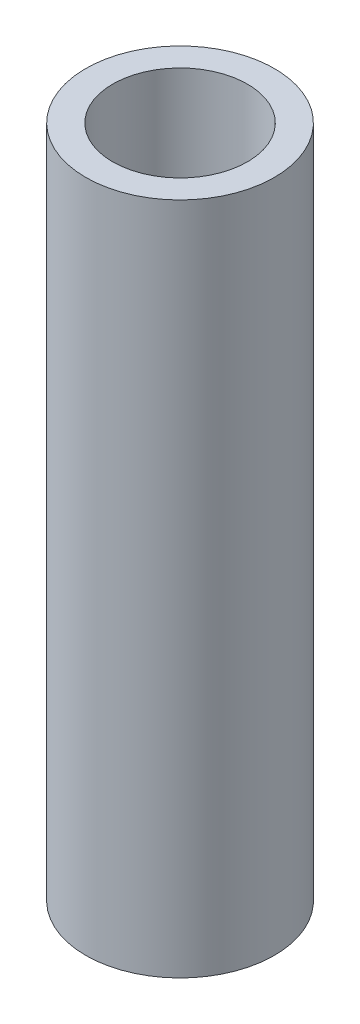
ISO-10303-21;
HEADER;
FILE_DESCRIPTION(('STEP AP214'),'2;1');
FILE_NAME('part.step','',(''),(''),'','','');
FILE_SCHEMA(('AUTOMOTIVE_DESIGN { 1 0 10303 214 1 1 1 1 }'));
ENDSEC;
DATA;
#1=APPLICATION_CONTEXT('core data for automotive mechanical design processes');
#2=APPLICATION_PROTOCOL_DEFINITION('international standard','automotive_design',2000,#1);
#3=PRODUCT_CONTEXT('',#1,'mechanical');
#4=PRODUCT('Part','Part','',(#3));
#5=PRODUCT_RELATED_PRODUCT_CATEGORY('part','',(#4));
#6=PRODUCT_DEFINITION_FORMATION('','',#4);
#7=PRODUCT_DEFINITION_CONTEXT('part definition',#1,'design');
#8=PRODUCT_DEFINITION('design','',#6,#7);
#9=PRODUCT_DEFINITION_SHAPE('','',#8);
#10=(LENGTH_UNIT() NAMED_UNIT(*) SI_UNIT(.MILLI.,.METRE.));
#11=(NAMED_UNIT(*) PLANE_ANGLE_UNIT() SI_UNIT($,.RADIAN.));
#12=(NAMED_UNIT(*) SI_UNIT($,.STERADIAN.) SOLID_ANGLE_UNIT());
#13=UNCERTAINTY_MEASURE_WITH_UNIT(LENGTH_MEASURE(1.E-05),#10,'distance_accuracy_value','');
#14=(GEOMETRIC_REPRESENTATION_CONTEXT(3) GLOBAL_UNCERTAINTY_ASSIGNED_CONTEXT((#13)) GLOBAL_UNIT_ASSIGNED_CONTEXT((#10,
#11,#12)) REPRESENTATION_CONTEXT('',''));
#15=CARTESIAN_POINT('',(0.,0.,0.));
#16=DIRECTION('',(0.,0.,1.));
#17=DIRECTION('',(1.,0.,0.));
#18=AXIS2_PLACEMENT_3D('',#15,#16,#17);
#19=CARTESIAN_POINT('',(0.,25.,0.));
#20=DIRECTION('',(0.,1.,0.));
#21=DIRECTION('',(0.,0.,1.));
#22=AXIS2_PLACEMENT_3D('',#19,#20,#21);
#23=PLANE('',#22);
#24=CARTESIAN_POINT('',(0.,25.,0.));
#25=DIRECTION('',(0.,1.,0.));
#26=DIRECTION('',(0.,0.,1.));
#27=AXIS2_PLACEMENT_3D('',#24,#25,#26);
#28=CIRCLE('',#27,3.5);
#29=CARTESIAN_POINT('',(0.,25.,3.5));
#30=VERTEX_POINT('',#29);
#31=EDGE_CURVE('E10',#30,#30,#28,.T.);
#32=ORIENTED_EDGE('',*,*,#31,.T.);
#33=EDGE_LOOP('',(#32));
#34=FACE_BOUND('',#33,.T.);
#35=CARTESIAN_POINT('',(0.,25.,0.));
#36=DIRECTION('',(0.,1.,0.));
#37=DIRECTION('',(0.,0.,1.));
#38=AXIS2_PLACEMENT_3D('',#35,#36,#37);
#39=CIRCLE('',#38,2.5);
#40=CARTESIAN_POINT('',(0.,25.,2.5));
#41=VERTEX_POINT('',#40);
#42=EDGE_CURVE('E44',#41,#41,#39,.T.);
#43=ORIENTED_EDGE('',*,*,#42,.F.);
#44=EDGE_LOOP('',(#43));
#45=FACE_BOUND('',#44,.T.);
#46=ADVANCED_FACE('F33',(#34,#45),#23,.T.);
#47=CARTESIAN_POINT('',(0.,0.,0.));
#48=DIRECTION('',(0.,1.,0.));
#49=DIRECTION('',(0.,0.,1.));
#50=AXIS2_PLACEMENT_3D('',#47,#48,#49);
#51=PLANE('',#50);
#52=CARTESIAN_POINT('',(0.,0.,0.));
#53=DIRECTION('',(0.,1.,0.));
#54=DIRECTION('',(0.,0.,1.));
#55=AXIS2_PLACEMENT_3D('',#52,#53,#54);
#56=CIRCLE('',#55,3.5);
#57=CARTESIAN_POINT('',(0.,0.,3.5));
#58=VERTEX_POINT('',#57);
#59=EDGE_CURVE('E37',#58,#58,#56,.T.);
#60=ORIENTED_EDGE('',*,*,#59,.F.);
#61=EDGE_LOOP('',(#60));
#62=FACE_BOUND('',#61,.T.);
#63=CARTESIAN_POINT('',(0.,0.,0.));
#64=DIRECTION('',(0.,1.,0.));
#65=DIRECTION('',(0.,0.,1.));
#66=AXIS2_PLACEMENT_3D('',#63,#64,#65);
#67=CIRCLE('',#66,2.5);
#68=CARTESIAN_POINT('',(0.,0.,2.5));
#69=VERTEX_POINT('',#68);
#70=EDGE_CURVE('E46',#69,#69,#67,.T.);
#71=ORIENTED_EDGE('',*,*,#70,.T.);
#72=EDGE_LOOP('',(#71));
#73=FACE_BOUND('',#72,.T.);
#74=ADVANCED_FACE('F56',(#62,#73),#51,.F.);
#75=CARTESIAN_POINT('',(0.,25.,0.));
#76=DIRECTION('',(0.,-1.,0.));
#77=DIRECTION('',(0.,0.,-1.));
#78=AXIS2_PLACEMENT_3D('',#75,#76,#77);
#79=CYLINDRICAL_SURFACE('',#78,3.5);
#80=ORIENTED_EDGE('',*,*,#31,.F.);
#81=EDGE_LOOP('',(#80));
#82=FACE_BOUND('',#81,.T.);
#83=ORIENTED_EDGE('',*,*,#59,.T.);
#84=EDGE_LOOP('',(#83));
#85=FACE_BOUND('',#84,.T.);
#86=ADVANCED_FACE('F35',(#82,#85),#79,.T.);
#87=CARTESIAN_POINT('',(0.,25.,0.));
#88=DIRECTION('',(0.,-1.,0.));
#89=DIRECTION('',(0.,0.,-1.));
#90=AXIS2_PLACEMENT_3D('',#87,#88,#89);
#91=CYLINDRICAL_SURFACE('',#90,2.5);
#92=ORIENTED_EDGE('',*,*,#42,.T.);
#93=EDGE_LOOP('',(#92));
#94=FACE_BOUND('',#93,.T.);
#95=ORIENTED_EDGE('',*,*,#70,.F.);
#96=EDGE_LOOP('',(#95));
#97=FACE_BOUND('',#96,.T.);
#98=ADVANCED_FACE('F52',(#94,#97),#91,.F.);
#99=CLOSED_SHELL('',(#46,#74,#86,#98));
#100=MANIFOLD_SOLID_BREP('B2',#99);
#101=ADVANCED_BREP_SHAPE_REPRESENTATION('',(#18,#100),#14);
#102=SHAPE_DEFINITION_REPRESENTATION(#9,#101);
ENDSEC;
END-ISO-10303-21;
